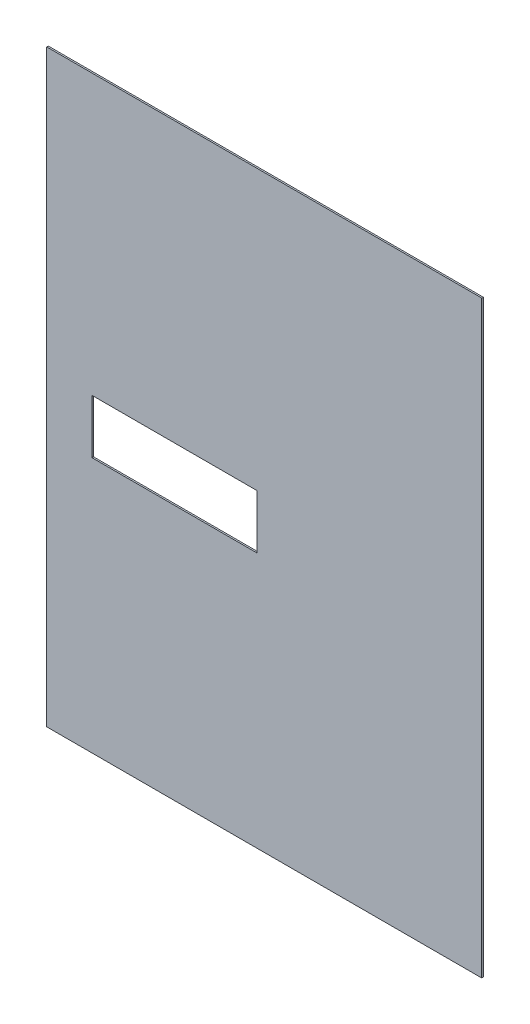
ISO-10303-21;
HEADER;
FILE_DESCRIPTION(('STEP AP214'),'2;1');
FILE_NAME('part.step','',(''),(''),'','','');
FILE_SCHEMA(('AUTOMOTIVE_DESIGN { 1 0 10303 214 1 1 1 1 }'));
ENDSEC;
DATA;
#1=APPLICATION_CONTEXT('core data for automotive mechanical design processes');
#2=APPLICATION_PROTOCOL_DEFINITION('international standard','automotive_design',2000,#1);
#3=PRODUCT_CONTEXT('',#1,'mechanical');
#4=PRODUCT('Part','Part','',(#3));
#5=PRODUCT_RELATED_PRODUCT_CATEGORY('part','',(#4));
#6=PRODUCT_DEFINITION_FORMATION('','',#4);
#7=PRODUCT_DEFINITION_CONTEXT('part definition',#1,'design');
#8=PRODUCT_DEFINITION('design','',#6,#7);
#9=PRODUCT_DEFINITION_SHAPE('','',#8);
#10=(LENGTH_UNIT() NAMED_UNIT(*) SI_UNIT(.MILLI.,.METRE.));
#11=(NAMED_UNIT(*) PLANE_ANGLE_UNIT() SI_UNIT($,.RADIAN.));
#12=(NAMED_UNIT(*) SI_UNIT($,.STERADIAN.) SOLID_ANGLE_UNIT());
#13=UNCERTAINTY_MEASURE_WITH_UNIT(LENGTH_MEASURE(1.E-05),#10,'distance_accuracy_value','');
#14=(GEOMETRIC_REPRESENTATION_CONTEXT(3) GLOBAL_UNCERTAINTY_ASSIGNED_CONTEXT((#13)) GLOBAL_UNIT_ASSIGNED_CONTEXT((#10,
#11,#12)) REPRESENTATION_CONTEXT('',''));
#15=CARTESIAN_POINT('',(0.,0.,0.));
#16=DIRECTION('',(0.,0.,1.));
#17=DIRECTION('',(1.,0.,0.));
#18=AXIS2_PLACEMENT_3D('',#15,#16,#17);
#19=CARTESIAN_POINT('',(0.,0.,10.));
#20=DIRECTION('',(0.,0.,-1.));
#21=DIRECTION('',(-1.,0.,0.));
#22=AXIS2_PLACEMENT_3D('',#19,#20,#21);
#23=PLANE('',#22);
#24=DIRECTION('',(0.,-1.,0.));
#25=VECTOR('',#24,1.);
#26=CARTESIAN_POINT('',(-828.,-1831.96637621148,10.));
#27=LINE('',#26,#25);
#28=CARTESIAN_POINT('',(-828.,1983.63383775998,10.));
#29=VERTEX_POINT('',#28);
#30=CARTESIAN_POINT('',(-828.,-1831.96637621148,10.));
#31=VERTEX_POINT('',#30);
#32=EDGE_CURVE('E134',#29,#31,#27,.T.);
#33=ORIENTED_EDGE('',*,*,#32,.T.);
#34=DIRECTION('',(1.,0.,0.));
#35=VECTOR('',#34,1.);
#36=CARTESIAN_POINT('',(-828.,-1831.96637621148,10.));
#37=LINE('',#36,#35);
#38=CARTESIAN_POINT('',(1990.80529725943,-1831.96637621148,10.));
#39=VERTEX_POINT('',#38);
#40=EDGE_CURVE('E137',#31,#39,#37,.T.);
#41=ORIENTED_EDGE('',*,*,#40,.T.);
#42=DIRECTION('',(0.,1.,0.));
#43=VECTOR('',#42,1.);
#44=CARTESIAN_POINT('',(1990.80529725943,-1831.96637621148,10.));
#45=LINE('',#44,#43);
#46=CARTESIAN_POINT('',(1990.80529725943,1983.63383775998,10.));
#47=VERTEX_POINT('',#46);
#48=EDGE_CURVE('E140',#39,#47,#45,.T.);
#49=ORIENTED_EDGE('',*,*,#48,.T.);
#50=DIRECTION('',(-1.,0.,0.));
#51=VECTOR('',#50,1.);
#52=CARTESIAN_POINT('',(-828.,1983.63383775998,10.));
#53=LINE('',#52,#51);
#54=EDGE_CURVE('E142',#47,#29,#53,.T.);
#55=ORIENTED_EDGE('',*,*,#54,.T.);
#56=EDGE_LOOP('',(#33,#41,#49,#55));
#57=FACE_BOUND('',#56,.T.);
#58=DIRECTION('',(0.,1.,0.));
#59=VECTOR('',#58,1.);
#60=CARTESIAN_POINT('',(535.,175.,10.));
#61=LINE('',#60,#59);
#62=CARTESIAN_POINT('',(535.,-175.,10.));
#63=VERTEX_POINT('',#62);
#64=CARTESIAN_POINT('',(535.,175.,10.));
#65=VERTEX_POINT('',#64);
#66=EDGE_CURVE('E98',#63,#65,#61,.T.);
#67=ORIENTED_EDGE('',*,*,#66,.F.);
#68=DIRECTION('',(1.,0.,0.));
#69=VECTOR('',#68,1.);
#70=CARTESIAN_POINT('',(-535.,-175.,10.));
#71=LINE('',#70,#69);
#72=CARTESIAN_POINT('',(-535.,-175.,10.));
#73=VERTEX_POINT('',#72);
#74=EDGE_CURVE('E120',#73,#63,#71,.T.);
#75=ORIENTED_EDGE('',*,*,#74,.F.);
#76=DIRECTION('',(0.,-1.,0.));
#77=VECTOR('',#76,1.);
#78=CARTESIAN_POINT('',(-535.,175.,10.));
#79=LINE('',#78,#77);
#80=CARTESIAN_POINT('',(-535.,175.,10.));
#81=VERTEX_POINT('',#80);
#82=EDGE_CURVE('E118',#81,#73,#79,.T.);
#83=ORIENTED_EDGE('',*,*,#82,.F.);
#84=DIRECTION('',(-1.,0.,0.));
#85=VECTOR('',#84,1.);
#86=CARTESIAN_POINT('',(-535.,175.,10.));
#87=LINE('',#86,#85);
#88=EDGE_CURVE('E106',#65,#81,#87,.T.);
#89=ORIENTED_EDGE('',*,*,#88,.F.);
#90=EDGE_LOOP('',(#67,#75,#83,#89));
#91=FACE_BOUND('',#90,.T.);
#92=ADVANCED_FACE('F33',(#57,#91),#23,.F.);
#93=CARTESIAN_POINT('',(0.,0.,0.));
#94=DIRECTION('',(0.,0.,-1.));
#95=DIRECTION('',(-1.,0.,0.));
#96=AXIS2_PLACEMENT_3D('',#93,#94,#95);
#97=PLANE('',#96);
#98=DIRECTION('',(0.,-1.,0.));
#99=VECTOR('',#98,1.);
#100=CARTESIAN_POINT('',(-828.,-1831.96637621148,0.));
#101=LINE('',#100,#99);
#102=CARTESIAN_POINT('',(-828.,1983.63383775998,0.));
#103=VERTEX_POINT('',#102);
#104=CARTESIAN_POINT('',(-828.,-1831.96637621148,0.));
#105=VERTEX_POINT('',#104);
#106=EDGE_CURVE('E114',#103,#105,#101,.T.);
#107=ORIENTED_EDGE('',*,*,#106,.F.);
#108=DIRECTION('',(-1.,0.,0.));
#109=VECTOR('',#108,1.);
#110=CARTESIAN_POINT('',(-828.,1983.63383775998,0.));
#111=LINE('',#110,#109);
#112=CARTESIAN_POINT('',(1990.80529725943,1983.63383775998,0.));
#113=VERTEX_POINT('',#112);
#114=EDGE_CURVE('E138',#113,#103,#111,.T.);
#115=ORIENTED_EDGE('',*,*,#114,.F.);
#116=DIRECTION('',(0.,1.,0.));
#117=VECTOR('',#116,1.);
#118=CARTESIAN_POINT('',(1990.80529725943,-1831.96637621148,0.));
#119=LINE('',#118,#117);
#120=CARTESIAN_POINT('',(1990.80529725943,-1831.96637621148,0.));
#121=VERTEX_POINT('',#120);
#122=EDGE_CURVE('E149',#121,#113,#119,.T.);
#123=ORIENTED_EDGE('',*,*,#122,.F.);
#124=DIRECTION('',(1.,0.,0.));
#125=VECTOR('',#124,1.);
#126=CARTESIAN_POINT('',(-828.,-1831.96637621148,0.));
#127=LINE('',#126,#125);
#128=EDGE_CURVE('E147',#105,#121,#127,.T.);
#129=ORIENTED_EDGE('',*,*,#128,.F.);
#130=EDGE_LOOP('',(#107,#115,#123,#129));
#131=FACE_BOUND('',#130,.T.);
#132=DIRECTION('',(1.,0.,0.));
#133=VECTOR('',#132,1.);
#134=CARTESIAN_POINT('',(-535.,-175.,0.));
#135=LINE('',#134,#133);
#136=CARTESIAN_POINT('',(-535.,-175.,0.));
#137=VERTEX_POINT('',#136);
#138=CARTESIAN_POINT('',(535.,-175.,0.));
#139=VERTEX_POINT('',#138);
#140=EDGE_CURVE('E107',#137,#139,#135,.T.);
#141=ORIENTED_EDGE('',*,*,#140,.T.);
#142=DIRECTION('',(0.,1.,0.));
#143=VECTOR('',#142,1.);
#144=CARTESIAN_POINT('',(535.,175.,0.));
#145=LINE('',#144,#143);
#146=CARTESIAN_POINT('',(535.,175.,0.));
#147=VERTEX_POINT('',#146);
#148=EDGE_CURVE('E56',#139,#147,#145,.T.);
#149=ORIENTED_EDGE('',*,*,#148,.T.);
#150=DIRECTION('',(-1.,0.,0.));
#151=VECTOR('',#150,1.);
#152=CARTESIAN_POINT('',(-535.,175.,0.));
#153=LINE('',#152,#151);
#154=CARTESIAN_POINT('',(-535.,175.,0.));
#155=VERTEX_POINT('',#154);
#156=EDGE_CURVE('E113',#147,#155,#153,.T.);
#157=ORIENTED_EDGE('',*,*,#156,.T.);
#158=DIRECTION('',(0.,-1.,0.));
#159=VECTOR('',#158,1.);
#160=CARTESIAN_POINT('',(-535.,175.,0.));
#161=LINE('',#160,#159);
#162=EDGE_CURVE('E126',#155,#137,#161,.T.);
#163=ORIENTED_EDGE('',*,*,#162,.T.);
#164=EDGE_LOOP('',(#141,#149,#157,#163));
#165=FACE_BOUND('',#164,.T.);
#166=ADVANCED_FACE('F167',(#131,#165),#97,.T.);
#167=CARTESIAN_POINT('',(-828.,-1831.96637621148,10.));
#168=DIRECTION('',(1.,0.,0.));
#169=DIRECTION('',(0.,0.,-1.));
#170=AXIS2_PLACEMENT_3D('',#167,#168,#169);
#171=PLANE('',#170);
#172=ORIENTED_EDGE('',*,*,#106,.T.);
#173=DIRECTION('',(0.,0.,-1.));
#174=VECTOR('',#173,1.);
#175=CARTESIAN_POINT('',(-828.,-1831.96637621148,10.));
#176=LINE('',#175,#174);
#177=EDGE_CURVE('E11',#31,#105,#176,.T.);
#178=ORIENTED_EDGE('',*,*,#177,.F.);
#179=ORIENTED_EDGE('',*,*,#32,.F.);
#180=DIRECTION('',(0.,0.,-1.));
#181=VECTOR('',#180,1.);
#182=CARTESIAN_POINT('',(-828.,1983.63383775998,10.));
#183=LINE('',#182,#181);
#184=EDGE_CURVE('E144',#29,#103,#183,.T.);
#185=ORIENTED_EDGE('',*,*,#184,.T.);
#186=EDGE_LOOP('',(#172,#178,#179,#185));
#187=FACE_BOUND('',#186,.T.);
#188=ADVANCED_FACE('F35',(#187),#171,.F.);
#189=CARTESIAN_POINT('',(-828.,-1831.96637621148,10.));
#190=DIRECTION('',(0.,1.,0.));
#191=DIRECTION('',(0.,0.,1.));
#192=AXIS2_PLACEMENT_3D('',#189,#190,#191);
#193=PLANE('',#192);
#194=ORIENTED_EDGE('',*,*,#128,.T.);
#195=DIRECTION('',(0.,0.,-1.));
#196=VECTOR('',#195,1.);
#197=CARTESIAN_POINT('',(1990.80529725943,-1831.96637621148,10.));
#198=LINE('',#197,#196);
#199=EDGE_CURVE('E41',#39,#121,#198,.T.);
#200=ORIENTED_EDGE('',*,*,#199,.F.);
#201=ORIENTED_EDGE('',*,*,#40,.F.);
#202=ORIENTED_EDGE('',*,*,#177,.T.);
#203=EDGE_LOOP('',(#194,#200,#201,#202));
#204=FACE_BOUND('',#203,.T.);
#205=ADVANCED_FACE('F177',(#204),#193,.F.);
#206=CARTESIAN_POINT('',(1990.80529725943,-1831.96637621148,10.));
#207=DIRECTION('',(-1.,0.,0.));
#208=DIRECTION('',(0.,0.,1.));
#209=AXIS2_PLACEMENT_3D('',#206,#207,#208);
#210=PLANE('',#209);
#211=ORIENTED_EDGE('',*,*,#122,.T.);
#212=DIRECTION('',(0.,0.,-1.));
#213=VECTOR('',#212,1.);
#214=CARTESIAN_POINT('',(1990.80529725943,1983.63383775998,10.));
#215=LINE('',#214,#213);
#216=EDGE_CURVE('E154',#47,#113,#215,.T.);
#217=ORIENTED_EDGE('',*,*,#216,.F.);
#218=ORIENTED_EDGE('',*,*,#48,.F.);
#219=ORIENTED_EDGE('',*,*,#199,.T.);
#220=EDGE_LOOP('',(#211,#217,#218,#219));
#221=FACE_BOUND('',#220,.T.);
#222=ADVANCED_FACE('F161',(#221),#210,.F.);
#223=CARTESIAN_POINT('',(-828.,1983.63383775998,10.));
#224=DIRECTION('',(0.,-1.,0.));
#225=DIRECTION('',(0.,0.,-1.));
#226=AXIS2_PLACEMENT_3D('',#223,#224,#225);
#227=PLANE('',#226);
#228=ORIENTED_EDGE('',*,*,#114,.T.);
#229=ORIENTED_EDGE('',*,*,#184,.F.);
#230=ORIENTED_EDGE('',*,*,#54,.F.);
#231=ORIENTED_EDGE('',*,*,#216,.T.);
#232=EDGE_LOOP('',(#228,#229,#230,#231));
#233=FACE_BOUND('',#232,.T.);
#234=ADVANCED_FACE('F171',(#233),#227,.F.);
#235=CARTESIAN_POINT('',(535.,175.,10.));
#236=DIRECTION('',(-1.,0.,0.));
#237=DIRECTION('',(0.,0.,1.));
#238=AXIS2_PLACEMENT_3D('',#235,#236,#237);
#239=PLANE('',#238);
#240=ORIENTED_EDGE('',*,*,#148,.F.);
#241=DIRECTION('',(0.,0.,-1.));
#242=VECTOR('',#241,1.);
#243=CARTESIAN_POINT('',(535.,-175.,10.));
#244=LINE('',#243,#242);
#245=EDGE_CURVE('E102',#63,#139,#244,.T.);
#246=ORIENTED_EDGE('',*,*,#245,.F.);
#247=ORIENTED_EDGE('',*,*,#66,.T.);
#248=DIRECTION('',(0.,0.,-1.));
#249=VECTOR('',#248,1.);
#250=CARTESIAN_POINT('',(535.,175.,10.));
#251=LINE('',#250,#249);
#252=EDGE_CURVE('E101',#65,#147,#251,.T.);
#253=ORIENTED_EDGE('',*,*,#252,.T.);
#254=EDGE_LOOP('',(#240,#246,#247,#253));
#255=FACE_BOUND('',#254,.T.);
#256=ADVANCED_FACE('F100',(#255),#239,.T.);
#257=CARTESIAN_POINT('',(-535.,175.,10.));
#258=DIRECTION('',(0.,-1.,0.));
#259=DIRECTION('',(0.,0.,-1.));
#260=AXIS2_PLACEMENT_3D('',#257,#258,#259);
#261=PLANE('',#260);
#262=ORIENTED_EDGE('',*,*,#156,.F.);
#263=ORIENTED_EDGE('',*,*,#252,.F.);
#264=ORIENTED_EDGE('',*,*,#88,.T.);
#265=DIRECTION('',(0.,0.,-1.));
#266=VECTOR('',#265,1.);
#267=CARTESIAN_POINT('',(-535.,175.,10.));
#268=LINE('',#267,#266);
#269=EDGE_CURVE('E115',#81,#155,#268,.T.);
#270=ORIENTED_EDGE('',*,*,#269,.T.);
#271=EDGE_LOOP('',(#262,#263,#264,#270));
#272=FACE_BOUND('',#271,.T.);
#273=ADVANCED_FACE('F110',(#272),#261,.T.);
#274=CARTESIAN_POINT('',(-535.,175.,10.));
#275=DIRECTION('',(1.,0.,0.));
#276=DIRECTION('',(0.,0.,-1.));
#277=AXIS2_PLACEMENT_3D('',#274,#275,#276);
#278=PLANE('',#277);
#279=ORIENTED_EDGE('',*,*,#162,.F.);
#280=ORIENTED_EDGE('',*,*,#269,.F.);
#281=ORIENTED_EDGE('',*,*,#82,.T.);
#282=DIRECTION('',(0.,0.,-1.));
#283=VECTOR('',#282,1.);
#284=CARTESIAN_POINT('',(-535.,-175.,10.));
#285=LINE('',#284,#283);
#286=EDGE_CURVE('E48',#73,#137,#285,.T.);
#287=ORIENTED_EDGE('',*,*,#286,.T.);
#288=EDGE_LOOP('',(#279,#280,#281,#287));
#289=FACE_BOUND('',#288,.T.);
#290=ADVANCED_FACE('F200',(#289),#278,.T.);
#291=CARTESIAN_POINT('',(-535.,-175.,10.));
#292=DIRECTION('',(0.,1.,0.));
#293=DIRECTION('',(0.,0.,1.));
#294=AXIS2_PLACEMENT_3D('',#291,#292,#293);
#295=PLANE('',#294);
#296=ORIENTED_EDGE('',*,*,#140,.F.);
#297=ORIENTED_EDGE('',*,*,#286,.F.);
#298=ORIENTED_EDGE('',*,*,#74,.T.);
#299=ORIENTED_EDGE('',*,*,#245,.T.);
#300=EDGE_LOOP('',(#296,#297,#298,#299));
#301=FACE_BOUND('',#300,.T.);
#302=ADVANCED_FACE('F204',(#301),#295,.T.);
#303=CLOSED_SHELL('',(#92,#166,#188,#205,#222,#234,#256,#273,#290,#302));
#304=MANIFOLD_SOLID_BREP('B2',#303);
#305=ADVANCED_BREP_SHAPE_REPRESENTATION('',(#18,#304),#14);
#306=SHAPE_DEFINITION_REPRESENTATION(#9,#305);
ENDSEC;
END-ISO-10303-21;
